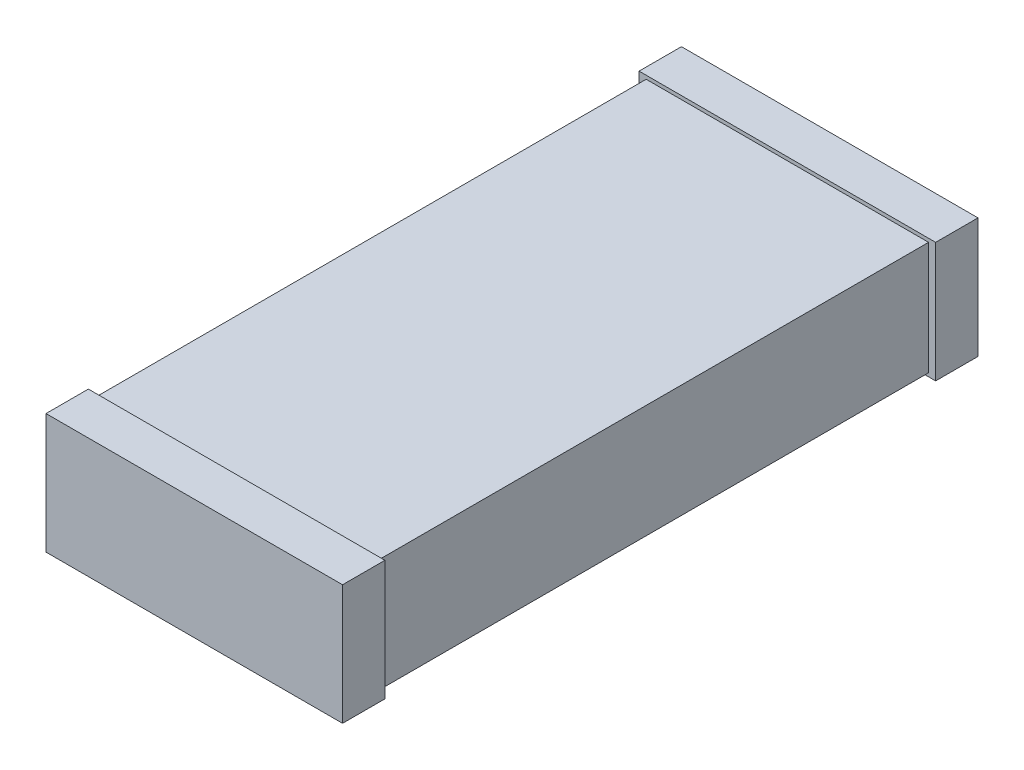
ISO-10303-21;
HEADER;
FILE_DESCRIPTION(('STEP AP214'),'2;1');
FILE_NAME('part.step','',(''),(''),'','','');
FILE_SCHEMA(('AUTOMOTIVE_DESIGN { 1 0 10303 214 1 1 1 1 }'));
ENDSEC;
DATA;
#1=APPLICATION_CONTEXT('core data for automotive mechanical design processes');
#2=APPLICATION_PROTOCOL_DEFINITION('international standard','automotive_design',2000,#1);
#3=PRODUCT_CONTEXT('',#1,'mechanical');
#4=PRODUCT('Part','Part','',(#3));
#5=PRODUCT_RELATED_PRODUCT_CATEGORY('part','',(#4));
#6=PRODUCT_DEFINITION_FORMATION('','',#4);
#7=PRODUCT_DEFINITION_CONTEXT('part definition',#1,'design');
#8=PRODUCT_DEFINITION('design','',#6,#7);
#9=PRODUCT_DEFINITION_SHAPE('','',#8);
#10=(LENGTH_UNIT() NAMED_UNIT(*) SI_UNIT(.MILLI.,.METRE.));
#11=(NAMED_UNIT(*) PLANE_ANGLE_UNIT() SI_UNIT($,.RADIAN.));
#12=(NAMED_UNIT(*) SI_UNIT($,.STERADIAN.) SOLID_ANGLE_UNIT());
#13=UNCERTAINTY_MEASURE_WITH_UNIT(LENGTH_MEASURE(1.E-05),#10,'distance_accuracy_value','');
#14=(GEOMETRIC_REPRESENTATION_CONTEXT(3) GLOBAL_UNCERTAINTY_ASSIGNED_CONTEXT((#13)) GLOBAL_UNIT_ASSIGNED_CONTEXT((#10,
#11,#12)) REPRESENTATION_CONTEXT('',''));
#15=CARTESIAN_POINT('',(0.,0.,0.));
#16=DIRECTION('',(0.,0.,1.));
#17=DIRECTION('',(1.,0.,0.));
#18=AXIS2_PLACEMENT_3D('',#15,#16,#17);
#19=CARTESIAN_POINT('',(1.,0.4,1.95));
#20=DIRECTION('',(-1.,0.,0.));
#21=DIRECTION('',(0.,0.,1.));
#22=AXIS2_PLACEMENT_3D('',#19,#20,#21);
#23=PLANE('',#22);
#24=DIRECTION('',(0.,0.,-1.));
#25=VECTOR('',#24,1.);
#26=CARTESIAN_POINT('',(1.,-0.4,1.95));
#27=LINE('',#26,#25);
#28=CARTESIAN_POINT('',(1.,-0.4,1.95));
#29=VERTEX_POINT('',#28);
#30=CARTESIAN_POINT('',(1.,-0.4,-1.95));
#31=VERTEX_POINT('',#30);
#32=EDGE_CURVE('E222',#29,#31,#27,.T.);
#33=ORIENTED_EDGE('',*,*,#32,.T.);
#34=DIRECTION('',(0.,1.,0.));
#35=VECTOR('',#34,1.);
#36=CARTESIAN_POINT('',(1.,0.4,-1.95));
#37=LINE('',#36,#35);
#38=CARTESIAN_POINT('',(1.,0.4,-1.95));
#39=VERTEX_POINT('',#38);
#40=EDGE_CURVE('E139',#31,#39,#37,.T.);
#41=ORIENTED_EDGE('',*,*,#40,.T.);
#42=DIRECTION('',(0.,0.,-1.));
#43=VECTOR('',#42,1.);
#44=CARTESIAN_POINT('',(1.,0.4,1.95));
#45=LINE('',#44,#43);
#46=CARTESIAN_POINT('',(1.,0.4,1.95));
#47=VERTEX_POINT('',#46);
#48=EDGE_CURVE('E11',#47,#39,#45,.T.);
#49=ORIENTED_EDGE('',*,*,#48,.F.);
#50=DIRECTION('',(0.,1.,0.));
#51=VECTOR('',#50,1.);
#52=CARTESIAN_POINT('',(1.,0.4,1.95));
#53=LINE('',#52,#51);
#54=EDGE_CURVE('E210',#29,#47,#53,.T.);
#55=ORIENTED_EDGE('',*,*,#54,.F.);
#56=EDGE_LOOP('',(#33,#41,#49,#55));
#57=FACE_BOUND('',#56,.T.);
#58=ADVANCED_FACE('F39',(#57),#23,.F.);
#59=CARTESIAN_POINT('',(-1.,0.4,1.95));
#60=DIRECTION('',(0.,-1.,0.));
#61=DIRECTION('',(0.,0.,-1.));
#62=AXIS2_PLACEMENT_3D('',#59,#60,#61);
#63=PLANE('',#62);
#64=ORIENTED_EDGE('',*,*,#48,.T.);
#65=DIRECTION('',(-1.,0.,0.));
#66=VECTOR('',#65,1.);
#67=CARTESIAN_POINT('',(-1.,0.4,-1.95));
#68=LINE('',#67,#66);
#69=CARTESIAN_POINT('',(-1.,0.4,-1.95));
#70=VERTEX_POINT('',#69);
#71=EDGE_CURVE('E178',#39,#70,#68,.T.);
#72=ORIENTED_EDGE('',*,*,#71,.T.);
#73=DIRECTION('',(0.,0.,-1.));
#74=VECTOR('',#73,1.);
#75=CARTESIAN_POINT('',(-1.,0.4,1.95));
#76=LINE('',#75,#74);
#77=CARTESIAN_POINT('',(-1.,0.4,1.95));
#78=VERTEX_POINT('',#77);
#79=EDGE_CURVE('E46',#78,#70,#76,.T.);
#80=ORIENTED_EDGE('',*,*,#79,.F.);
#81=DIRECTION('',(-1.,0.,0.));
#82=VECTOR('',#81,1.);
#83=CARTESIAN_POINT('',(-1.,0.4,1.95));
#84=LINE('',#83,#82);
#85=EDGE_CURVE('E213',#47,#78,#84,.T.);
#86=ORIENTED_EDGE('',*,*,#85,.F.);
#87=EDGE_LOOP('',(#64,#72,#80,#86));
#88=FACE_BOUND('',#87,.T.);
#89=ADVANCED_FACE('F226',(#88),#63,.F.);
#90=CARTESIAN_POINT('',(-1.,0.4,1.95));
#91=DIRECTION('',(1.,0.,0.));
#92=DIRECTION('',(0.,0.,-1.));
#93=AXIS2_PLACEMENT_3D('',#90,#91,#92);
#94=PLANE('',#93);
#95=ORIENTED_EDGE('',*,*,#79,.T.);
#96=DIRECTION('',(0.,-1.,0.));
#97=VECTOR('',#96,1.);
#98=CARTESIAN_POINT('',(-1.,0.4,-1.95));
#99=LINE('',#98,#97);
#100=CARTESIAN_POINT('',(-1.,-0.4,-1.95));
#101=VERTEX_POINT('',#100);
#102=EDGE_CURVE('E176',#70,#101,#99,.T.);
#103=ORIENTED_EDGE('',*,*,#102,.T.);
#104=DIRECTION('',(0.,0.,-1.));
#105=VECTOR('',#104,1.);
#106=CARTESIAN_POINT('',(-1.,-0.4,1.95));
#107=LINE('',#106,#105);
#108=CARTESIAN_POINT('',(-1.,-0.4,1.95));
#109=VERTEX_POINT('',#108);
#110=EDGE_CURVE('E53',#109,#101,#107,.T.);
#111=ORIENTED_EDGE('',*,*,#110,.F.);
#112=DIRECTION('',(0.,-1.,0.));
#113=VECTOR('',#112,1.);
#114=CARTESIAN_POINT('',(-1.,0.4,1.95));
#115=LINE('',#114,#113);
#116=EDGE_CURVE('E216',#78,#109,#115,.T.);
#117=ORIENTED_EDGE('',*,*,#116,.F.);
#118=EDGE_LOOP('',(#95,#103,#111,#117));
#119=FACE_BOUND('',#118,.T.);
#120=ADVANCED_FACE('F225',(#119),#94,.F.);
#121=CARTESIAN_POINT('',(-1.,-0.4,1.95));
#122=DIRECTION('',(0.,1.,0.));
#123=DIRECTION('',(0.,0.,1.));
#124=AXIS2_PLACEMENT_3D('',#121,#122,#123);
#125=PLANE('',#124);
#126=ORIENTED_EDGE('',*,*,#110,.T.);
#127=DIRECTION('',(1.,0.,0.));
#128=VECTOR('',#127,1.);
#129=CARTESIAN_POINT('',(-1.,-0.4,-1.95));
#130=LINE('',#129,#128);
#131=EDGE_CURVE('E173',#101,#31,#130,.T.);
#132=ORIENTED_EDGE('',*,*,#131,.T.);
#133=ORIENTED_EDGE('',*,*,#32,.F.);
#134=DIRECTION('',(1.,0.,0.));
#135=VECTOR('',#134,1.);
#136=CARTESIAN_POINT('',(-1.,-0.4,1.95));
#137=LINE('',#136,#135);
#138=EDGE_CURVE('E219',#109,#29,#137,.T.);
#139=ORIENTED_EDGE('',*,*,#138,.F.);
#140=EDGE_LOOP('',(#126,#132,#133,#139));
#141=FACE_BOUND('',#140,.T.);
#142=ADVANCED_FACE('F232',(#141),#125,.F.);
#143=CARTESIAN_POINT('',(0.,0.,1.95));
#144=DIRECTION('',(0.,0.,-1.));
#145=DIRECTION('',(-1.,0.,0.));
#146=AXIS2_PLACEMENT_3D('',#143,#144,#145);
#147=PLANE('',#146);
#148=DIRECTION('',(0.,1.,0.));
#149=VECTOR('',#148,1.);
#150=CARTESIAN_POINT('',(1.05,-0.425,1.95));
#151=LINE('',#150,#149);
#152=CARTESIAN_POINT('',(1.05,-0.425,1.95));
#153=VERTEX_POINT('',#152);
#154=CARTESIAN_POINT('',(1.05,0.425,1.95));
#155=VERTEX_POINT('',#154);
#156=EDGE_CURVE('E180',#153,#155,#151,.T.);
#157=ORIENTED_EDGE('',*,*,#156,.F.);
#158=DIRECTION('',(1.,0.,0.));
#159=VECTOR('',#158,1.);
#160=CARTESIAN_POINT('',(-1.05,-0.425,1.95));
#161=LINE('',#160,#159);
#162=CARTESIAN_POINT('',(-1.05,-0.425,1.95));
#163=VERTEX_POINT('',#162);
#164=EDGE_CURVE('E185',#163,#153,#161,.T.);
#165=ORIENTED_EDGE('',*,*,#164,.F.);
#166=DIRECTION('',(0.,-1.,0.));
#167=VECTOR('',#166,1.);
#168=CARTESIAN_POINT('',(-1.05,-0.425,1.95));
#169=LINE('',#168,#167);
#170=CARTESIAN_POINT('',(-1.05,0.425,1.95));
#171=VERTEX_POINT('',#170);
#172=EDGE_CURVE('E196',#171,#163,#169,.T.);
#173=ORIENTED_EDGE('',*,*,#172,.F.);
#174=DIRECTION('',(-1.,0.,0.));
#175=VECTOR('',#174,1.);
#176=CARTESIAN_POINT('',(-1.05,0.425,1.95));
#177=LINE('',#176,#175);
#178=EDGE_CURVE('E194',#155,#171,#177,.T.);
#179=ORIENTED_EDGE('',*,*,#178,.F.);
#180=EDGE_LOOP('',(#157,#165,#173,#179));
#181=FACE_BOUND('',#180,.T.);
#182=ORIENTED_EDGE('',*,*,#54,.T.);
#183=ORIENTED_EDGE('',*,*,#85,.T.);
#184=ORIENTED_EDGE('',*,*,#116,.T.);
#185=ORIENTED_EDGE('',*,*,#138,.T.);
#186=EDGE_LOOP('',(#182,#183,#184,#185));
#187=FACE_BOUND('',#186,.T.);
#188=ADVANCED_FACE('F234',(#181,#187),#147,.T.);
#189=CARTESIAN_POINT('',(1.05,-0.425,2.25));
#190=DIRECTION('',(-1.,0.,0.));
#191=DIRECTION('',(0.,0.,1.));
#192=AXIS2_PLACEMENT_3D('',#189,#190,#191);
#193=PLANE('',#192);
#194=ORIENTED_EDGE('',*,*,#156,.T.);
#195=DIRECTION('',(0.,0.,-1.));
#196=VECTOR('',#195,1.);
#197=CARTESIAN_POINT('',(1.05,0.425,2.25));
#198=LINE('',#197,#196);
#199=CARTESIAN_POINT('',(1.05,0.425,2.25));
#200=VERTEX_POINT('',#199);
#201=EDGE_CURVE('E207',#200,#155,#198,.T.);
#202=ORIENTED_EDGE('',*,*,#201,.F.);
#203=DIRECTION('',(0.,1.,0.));
#204=VECTOR('',#203,1.);
#205=CARTESIAN_POINT('',(1.05,-0.425,2.25));
#206=LINE('',#205,#204);
#207=CARTESIAN_POINT('',(1.05,-0.425,2.25));
#208=VERTEX_POINT('',#207);
#209=EDGE_CURVE('E181',#208,#200,#206,.T.);
#210=ORIENTED_EDGE('',*,*,#209,.F.);
#211=DIRECTION('',(0.,0.,-1.));
#212=VECTOR('',#211,1.);
#213=CARTESIAN_POINT('',(1.05,-0.425,2.25));
#214=LINE('',#213,#212);
#215=EDGE_CURVE('E191',#208,#153,#214,.T.);
#216=ORIENTED_EDGE('',*,*,#215,.T.);
#217=EDGE_LOOP('',(#194,#202,#210,#216));
#218=FACE_BOUND('',#217,.T.);
#219=ADVANCED_FACE('F247',(#218),#193,.F.);
#220=CARTESIAN_POINT('',(-1.05,0.425,2.25));
#221=DIRECTION('',(0.,-1.,0.));
#222=DIRECTION('',(0.,0.,-1.));
#223=AXIS2_PLACEMENT_3D('',#220,#221,#222);
#224=PLANE('',#223);
#225=ORIENTED_EDGE('',*,*,#178,.T.);
#226=DIRECTION('',(0.,0.,-1.));
#227=VECTOR('',#226,1.);
#228=CARTESIAN_POINT('',(-1.05,0.425,2.25));
#229=LINE('',#228,#227);
#230=CARTESIAN_POINT('',(-1.05,0.425,2.25));
#231=VERTEX_POINT('',#230);
#232=EDGE_CURVE('E204',#231,#171,#229,.T.);
#233=ORIENTED_EDGE('',*,*,#232,.F.);
#234=DIRECTION('',(-1.,0.,0.));
#235=VECTOR('',#234,1.);
#236=CARTESIAN_POINT('',(-1.05,0.425,2.25));
#237=LINE('',#236,#235);
#238=EDGE_CURVE('E184',#200,#231,#237,.T.);
#239=ORIENTED_EDGE('',*,*,#238,.F.);
#240=ORIENTED_EDGE('',*,*,#201,.T.);
#241=EDGE_LOOP('',(#225,#233,#239,#240));
#242=FACE_BOUND('',#241,.T.);
#243=ADVANCED_FACE('F250',(#242),#224,.F.);
#244=CARTESIAN_POINT('',(-1.05,-0.425,2.25));
#245=DIRECTION('',(1.,0.,0.));
#246=DIRECTION('',(0.,0.,-1.));
#247=AXIS2_PLACEMENT_3D('',#244,#245,#246);
#248=PLANE('',#247);
#249=ORIENTED_EDGE('',*,*,#172,.T.);
#250=DIRECTION('',(0.,0.,-1.));
#251=VECTOR('',#250,1.);
#252=CARTESIAN_POINT('',(-1.05,-0.425,2.25));
#253=LINE('',#252,#251);
#254=CARTESIAN_POINT('',(-1.05,-0.425,2.25));
#255=VERTEX_POINT('',#254);
#256=EDGE_CURVE('E201',#255,#163,#253,.T.);
#257=ORIENTED_EDGE('',*,*,#256,.F.);
#258=DIRECTION('',(0.,-1.,0.));
#259=VECTOR('',#258,1.);
#260=CARTESIAN_POINT('',(-1.05,-0.425,2.25));
#261=LINE('',#260,#259);
#262=EDGE_CURVE('E187',#231,#255,#261,.T.);
#263=ORIENTED_EDGE('',*,*,#262,.F.);
#264=ORIENTED_EDGE('',*,*,#232,.T.);
#265=EDGE_LOOP('',(#249,#257,#263,#264));
#266=FACE_BOUND('',#265,.T.);
#267=ADVANCED_FACE('F254',(#266),#248,.F.);
#268=CARTESIAN_POINT('',(-1.05,-0.425,2.25));
#269=DIRECTION('',(0.,1.,0.));
#270=DIRECTION('',(0.,0.,1.));
#271=AXIS2_PLACEMENT_3D('',#268,#269,#270);
#272=PLANE('',#271);
#273=ORIENTED_EDGE('',*,*,#164,.T.);
#274=ORIENTED_EDGE('',*,*,#215,.F.);
#275=DIRECTION('',(1.,0.,0.));
#276=VECTOR('',#275,1.);
#277=CARTESIAN_POINT('',(-1.05,-0.425,2.25));
#278=LINE('',#277,#276);
#279=EDGE_CURVE('E189',#255,#208,#278,.T.);
#280=ORIENTED_EDGE('',*,*,#279,.F.);
#281=ORIENTED_EDGE('',*,*,#256,.T.);
#282=EDGE_LOOP('',(#273,#274,#280,#281));
#283=FACE_BOUND('',#282,.T.);
#284=ADVANCED_FACE('F258',(#283),#272,.F.);
#285=CARTESIAN_POINT('',(0.,0.,2.25));
#286=DIRECTION('',(0.,0.,-1.));
#287=DIRECTION('',(-1.,0.,0.));
#288=AXIS2_PLACEMENT_3D('',#285,#286,#287);
#289=PLANE('',#288);
#290=ORIENTED_EDGE('',*,*,#209,.T.);
#291=ORIENTED_EDGE('',*,*,#238,.T.);
#292=ORIENTED_EDGE('',*,*,#262,.T.);
#293=ORIENTED_EDGE('',*,*,#279,.T.);
#294=EDGE_LOOP('',(#290,#291,#292,#293));
#295=FACE_BOUND('',#294,.T.);
#296=ADVANCED_FACE('F262',(#295),#289,.F.);
#297=CARTESIAN_POINT('',(0.,0.,-1.95));
#298=DIRECTION('',(0.,0.,1.));
#299=DIRECTION('',(-1.,0.,0.));
#300=AXIS2_PLACEMENT_3D('',#297,#298,#299);
#301=PLANE('',#300);
#302=DIRECTION('',(0.,1.,0.));
#303=VECTOR('',#302,1.);
#304=CARTESIAN_POINT('',(1.05,-0.425,-1.95));
#305=LINE('',#304,#303);
#306=CARTESIAN_POINT('',(1.05,-0.425,-1.95));
#307=VERTEX_POINT('',#306);
#308=CARTESIAN_POINT('',(1.05,0.425,-1.95));
#309=VERTEX_POINT('',#308);
#310=EDGE_CURVE('E134',#307,#309,#305,.T.);
#311=ORIENTED_EDGE('',*,*,#310,.T.);
#312=DIRECTION('',(-1.,0.,0.));
#313=VECTOR('',#312,1.);
#314=CARTESIAN_POINT('',(-1.05,0.425,-1.95));
#315=LINE('',#314,#313);
#316=CARTESIAN_POINT('',(-1.05,0.425,-1.95));
#317=VERTEX_POINT('',#316);
#318=EDGE_CURVE('E150',#309,#317,#315,.T.);
#319=ORIENTED_EDGE('',*,*,#318,.T.);
#320=DIRECTION('',(0.,-1.,0.));
#321=VECTOR('',#320,1.);
#322=CARTESIAN_POINT('',(-1.05,-0.425,-1.95));
#323=LINE('',#322,#321);
#324=CARTESIAN_POINT('',(-1.05,-0.425,-1.95));
#325=VERTEX_POINT('',#324);
#326=EDGE_CURVE('E162',#317,#325,#323,.T.);
#327=ORIENTED_EDGE('',*,*,#326,.T.);
#328=DIRECTION('',(1.,0.,0.));
#329=VECTOR('',#328,1.);
#330=CARTESIAN_POINT('',(-1.05,-0.425,-1.95));
#331=LINE('',#330,#329);
#332=EDGE_CURVE('E160',#325,#307,#331,.T.);
#333=ORIENTED_EDGE('',*,*,#332,.T.);
#334=EDGE_LOOP('',(#311,#319,#327,#333));
#335=FACE_BOUND('',#334,.T.);
#336=ORIENTED_EDGE('',*,*,#40,.F.);
#337=ORIENTED_EDGE('',*,*,#131,.F.);
#338=ORIENTED_EDGE('',*,*,#102,.F.);
#339=ORIENTED_EDGE('',*,*,#71,.F.);
#340=EDGE_LOOP('',(#336,#337,#338,#339));
#341=FACE_BOUND('',#340,.T.);
#342=ADVANCED_FACE('F229',(#335,#341),#301,.T.);
#343=CARTESIAN_POINT('',(1.05,-0.425,-2.25));
#344=DIRECTION('',(1.,0.,0.));
#345=DIRECTION('',(0.,0.,-1.));
#346=AXIS2_PLACEMENT_3D('',#343,#344,#345);
#347=PLANE('',#346);
#348=ORIENTED_EDGE('',*,*,#310,.F.);
#349=DIRECTION('',(0.,0.,1.));
#350=VECTOR('',#349,1.);
#351=CARTESIAN_POINT('',(1.05,-0.425,-2.25));
#352=LINE('',#351,#350);
#353=CARTESIAN_POINT('',(1.05,-0.425,-2.25));
#354=VERTEX_POINT('',#353);
#355=EDGE_CURVE('E128',#354,#307,#352,.T.);
#356=ORIENTED_EDGE('',*,*,#355,.F.);
#357=DIRECTION('',(0.,1.,0.));
#358=VECTOR('',#357,1.);
#359=CARTESIAN_POINT('',(1.05,-0.425,-2.25));
#360=LINE('',#359,#358);
#361=CARTESIAN_POINT('',(1.05,0.425,-2.25));
#362=VERTEX_POINT('',#361);
#363=EDGE_CURVE('E131',#354,#362,#360,.T.);
#364=ORIENTED_EDGE('',*,*,#363,.T.);
#365=DIRECTION('',(0.,0.,1.));
#366=VECTOR('',#365,1.);
#367=CARTESIAN_POINT('',(1.05,0.425,-2.25));
#368=LINE('',#367,#366);
#369=EDGE_CURVE('E158',#362,#309,#368,.T.);
#370=ORIENTED_EDGE('',*,*,#369,.T.);
#371=EDGE_LOOP('',(#348,#356,#364,#370));
#372=FACE_BOUND('',#371,.T.);
#373=ADVANCED_FACE('F130',(#372),#347,.T.);
#374=CARTESIAN_POINT('',(-1.05,-0.425,-2.25));
#375=DIRECTION('',(0.,-1.,0.));
#376=DIRECTION('',(0.,0.,-1.));
#377=AXIS2_PLACEMENT_3D('',#374,#375,#376);
#378=PLANE('',#377);
#379=ORIENTED_EDGE('',*,*,#332,.F.);
#380=DIRECTION('',(0.,0.,1.));
#381=VECTOR('',#380,1.);
#382=CARTESIAN_POINT('',(-1.05,-0.425,-2.25));
#383=LINE('',#382,#381);
#384=CARTESIAN_POINT('',(-1.05,-0.425,-2.25));
#385=VERTEX_POINT('',#384);
#386=EDGE_CURVE('E140',#385,#325,#383,.T.);
#387=ORIENTED_EDGE('',*,*,#386,.F.);
#388=DIRECTION('',(1.,0.,0.));
#389=VECTOR('',#388,1.);
#390=CARTESIAN_POINT('',(-1.05,-0.425,-2.25));
#391=LINE('',#390,#389);
#392=EDGE_CURVE('E146',#385,#354,#391,.T.);
#393=ORIENTED_EDGE('',*,*,#392,.T.);
#394=ORIENTED_EDGE('',*,*,#355,.T.);
#395=EDGE_LOOP('',(#379,#387,#393,#394));
#396=FACE_BOUND('',#395,.T.);
#397=ADVANCED_FACE('F152',(#396),#378,.T.);
#398=CARTESIAN_POINT('',(-1.05,-0.425,-2.25));
#399=DIRECTION('',(-1.,0.,0.));
#400=DIRECTION('',(0.,0.,1.));
#401=AXIS2_PLACEMENT_3D('',#398,#399,#400);
#402=PLANE('',#401);
#403=ORIENTED_EDGE('',*,*,#326,.F.);
#404=DIRECTION('',(0.,0.,1.));
#405=VECTOR('',#404,1.);
#406=CARTESIAN_POINT('',(-1.05,0.425,-2.25));
#407=LINE('',#406,#405);
#408=CARTESIAN_POINT('',(-1.05,0.425,-2.25));
#409=VERTEX_POINT('',#408);
#410=EDGE_CURVE('E168',#409,#317,#407,.T.);
#411=ORIENTED_EDGE('',*,*,#410,.F.);
#412=DIRECTION('',(0.,-1.,0.));
#413=VECTOR('',#412,1.);
#414=CARTESIAN_POINT('',(-1.05,-0.425,-2.25));
#415=LINE('',#414,#413);
#416=EDGE_CURVE('E153',#409,#385,#415,.T.);
#417=ORIENTED_EDGE('',*,*,#416,.T.);
#418=ORIENTED_EDGE('',*,*,#386,.T.);
#419=EDGE_LOOP('',(#403,#411,#417,#418));
#420=FACE_BOUND('',#419,.T.);
#421=ADVANCED_FACE('F274',(#420),#402,.T.);
#422=CARTESIAN_POINT('',(-1.05,0.425,-2.25));
#423=DIRECTION('',(0.,1.,0.));
#424=DIRECTION('',(0.,0.,1.));
#425=AXIS2_PLACEMENT_3D('',#422,#423,#424);
#426=PLANE('',#425);
#427=ORIENTED_EDGE('',*,*,#318,.F.);
#428=ORIENTED_EDGE('',*,*,#369,.F.);
#429=DIRECTION('',(-1.,0.,0.));
#430=VECTOR('',#429,1.);
#431=CARTESIAN_POINT('',(-1.05,0.425,-2.25));
#432=LINE('',#431,#430);
#433=EDGE_CURVE('E149',#362,#409,#432,.T.);
#434=ORIENTED_EDGE('',*,*,#433,.T.);
#435=ORIENTED_EDGE('',*,*,#410,.T.);
#436=EDGE_LOOP('',(#427,#428,#434,#435));
#437=FACE_BOUND('',#436,.T.);
#438=ADVANCED_FACE('F277',(#437),#426,.T.);
#439=CARTESIAN_POINT('',(0.,0.,-2.25));
#440=DIRECTION('',(0.,0.,1.));
#441=DIRECTION('',(-1.,0.,0.));
#442=AXIS2_PLACEMENT_3D('',#439,#440,#441);
#443=PLANE('',#442);
#444=ORIENTED_EDGE('',*,*,#363,.F.);
#445=ORIENTED_EDGE('',*,*,#392,.F.);
#446=ORIENTED_EDGE('',*,*,#416,.F.);
#447=ORIENTED_EDGE('',*,*,#433,.F.);
#448=EDGE_LOOP('',(#444,#445,#446,#447));
#449=FACE_BOUND('',#448,.T.);
#450=ADVANCED_FACE('F144',(#449),#443,.F.);
#451=CLOSED_SHELL('',(#58,#89,#120,#142,#188,#219,#243,#267,#284,#296,#342,#373,#397,#421,#438,#450));
#452=MANIFOLD_SOLID_BREP('B2',#451);
#453=ADVANCED_BREP_SHAPE_REPRESENTATION('',(#18,#452),#14);
#454=SHAPE_DEFINITION_REPRESENTATION(#9,#453);
ENDSEC;
END-ISO-10303-21;
